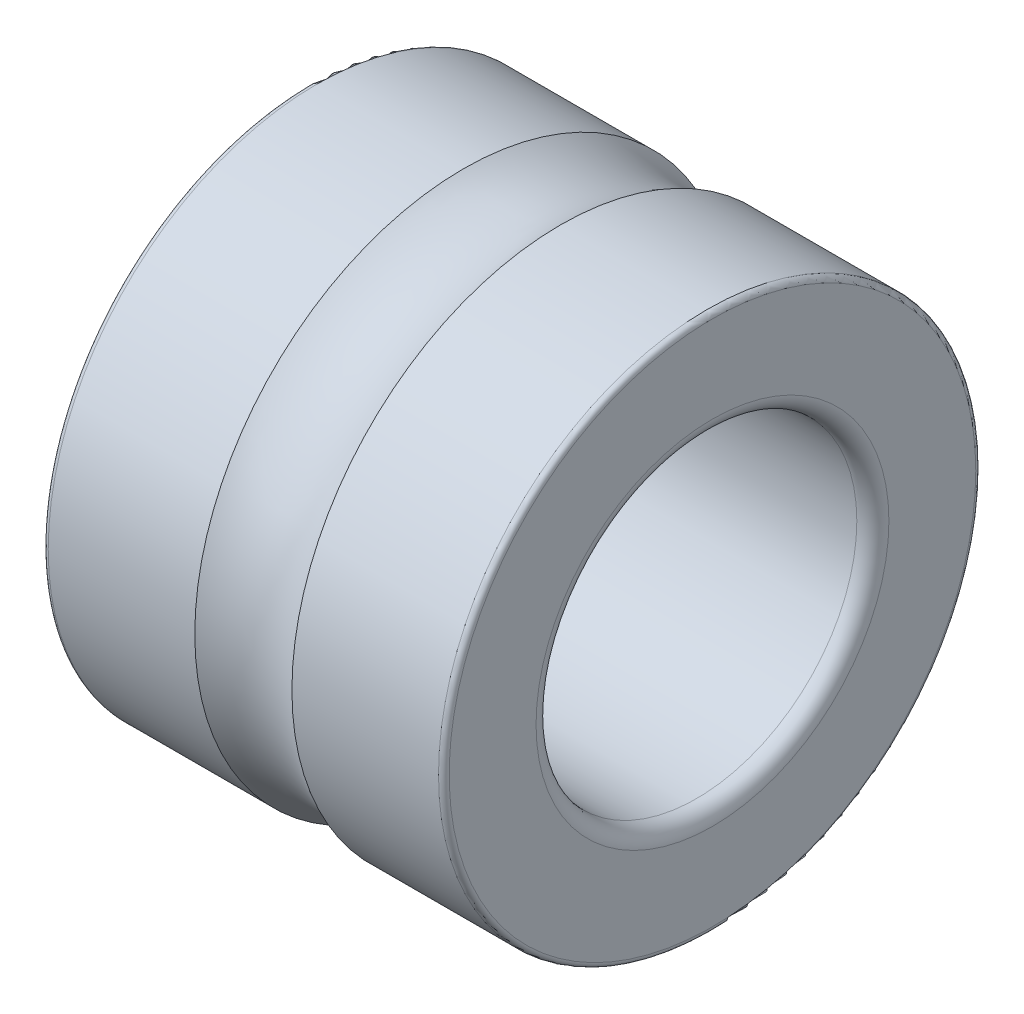
ISO-10303-21;
HEADER;
FILE_DESCRIPTION(('STEP AP214'),'2;1');
FILE_NAME('part.step','',(''),(''),'','','');
FILE_SCHEMA(('AUTOMOTIVE_DESIGN { 1 0 10303 214 1 1 1 1 }'));
ENDSEC;
DATA;
#1=APPLICATION_CONTEXT('core data for automotive mechanical design processes');
#2=APPLICATION_PROTOCOL_DEFINITION('international standard','automotive_design',2000,#1);
#3=PRODUCT_CONTEXT('',#1,'mechanical');
#4=PRODUCT('Part','Part','',(#3));
#5=PRODUCT_RELATED_PRODUCT_CATEGORY('part','',(#4));
#6=PRODUCT_DEFINITION_FORMATION('','',#4);
#7=PRODUCT_DEFINITION_CONTEXT('part definition',#1,'design');
#8=PRODUCT_DEFINITION('design','',#6,#7);
#9=PRODUCT_DEFINITION_SHAPE('','',#8);
#10=(LENGTH_UNIT() NAMED_UNIT(*) SI_UNIT(.MILLI.,.METRE.));
#11=(NAMED_UNIT(*) PLANE_ANGLE_UNIT() SI_UNIT($,.RADIAN.));
#12=(NAMED_UNIT(*) SI_UNIT($,.STERADIAN.) SOLID_ANGLE_UNIT());
#13=UNCERTAINTY_MEASURE_WITH_UNIT(LENGTH_MEASURE(1.E-05),#10,'distance_accuracy_value','');
#14=(GEOMETRIC_REPRESENTATION_CONTEXT(3) GLOBAL_UNCERTAINTY_ASSIGNED_CONTEXT((#13)) GLOBAL_UNIT_ASSIGNED_CONTEXT((#10,
#11,#12)) REPRESENTATION_CONTEXT('',''));
#15=CARTESIAN_POINT('',(0.,0.,0.));
#16=DIRECTION('',(0.,0.,1.));
#17=DIRECTION('',(1.,0.,0.));
#18=AXIS2_PLACEMENT_3D('',#15,#16,#17);
#19=CARTESIAN_POINT('',(2.5,0.,0.));
#20=DIRECTION('',(1.,0.,0.));
#21=DIRECTION('',(0.,0.,-1.));
#22=AXIS2_PLACEMENT_3D('',#19,#20,#21);
#23=TOROIDAL_SURFACE('',#22,4.375,1.1905);
#24=CARTESIAN_POINT('',(1.89447109895563,0.,0.));
#25=DIRECTION('',(-1.,0.,0.));
#26=DIRECTION('',(0.,0.,1.));
#27=AXIS2_PLACEMENT_3D('',#24,#25,#26);
#28=CIRCLE('',#27,3.35);
#29=CARTESIAN_POINT('',(1.89447109895563,0.,3.35));
#30=VERTEX_POINT('',#29);
#31=EDGE_CURVE('E143',#30,#30,#28,.T.);
#32=ORIENTED_EDGE('',*,*,#31,.F.);
#33=EDGE_LOOP('',(#32));
#34=FACE_BOUND('',#33,.T.);
#35=CARTESIAN_POINT('',(3.10552890104437,0.,0.));
#36=DIRECTION('',(-1.,0.,0.));
#37=DIRECTION('',(0.,0.,1.));
#38=AXIS2_PLACEMENT_3D('',#35,#36,#37);
#39=CIRCLE('',#38,3.35);
#40=CARTESIAN_POINT('',(3.10552890104437,0.,3.35));
#41=VERTEX_POINT('',#40);
#42=EDGE_CURVE('E151',#41,#41,#39,.F.);
#43=ORIENTED_EDGE('',*,*,#42,.F.);
#44=EDGE_LOOP('',(#43));
#45=FACE_BOUND('',#44,.T.);
#46=ADVANCED_FACE('F15',(#34,#45),#23,.F.);
#47=CARTESIAN_POINT('',(4.8,0.,0.));
#48=DIRECTION('',(-1.,0.,0.));
#49=DIRECTION('',(0.,0.,1.));
#50=AXIS2_PLACEMENT_3D('',#47,#48,#49);
#51=CYLINDRICAL_SURFACE('',#50,3.35);
#52=CARTESIAN_POINT('',(4.933333,0.,0.));
#53=DIRECTION('',(1.,0.,0.));
#54=DIRECTION('',(0.,0.,-1.));
#55=AXIS2_PLACEMENT_3D('',#52,#53,#54);
#56=CIRCLE('',#55,3.35);
#57=CARTESIAN_POINT('',(4.933333,0.,-3.35));
#58=VERTEX_POINT('',#57);
#59=EDGE_CURVE('E113',#58,#58,#56,.T.);
#60=ORIENTED_EDGE('',*,*,#59,.F.);
#61=EDGE_LOOP('',(#60));
#62=FACE_BOUND('',#61,.T.);
#63=ORIENTED_EDGE('',*,*,#42,.T.);
#64=EDGE_LOOP('',(#63));
#65=FACE_BOUND('',#64,.T.);
#66=ADVANCED_FACE('F158',(#62,#65),#51,.T.);
#67=CARTESIAN_POINT('',(4.8,0.,0.));
#68=DIRECTION('',(-1.,0.,0.));
#69=DIRECTION('',(0.,0.,1.));
#70=AXIS2_PLACEMENT_3D('',#67,#68,#69);
#71=CYLINDRICAL_SURFACE('',#70,3.35);
#72=ORIENTED_EDGE('',*,*,#31,.T.);
#73=EDGE_LOOP('',(#72));
#74=FACE_BOUND('',#73,.T.);
#75=CARTESIAN_POINT('',(0.0666669999999993,0.,0.));
#76=DIRECTION('',(1.,0.,0.));
#77=DIRECTION('',(0.,0.,-1.));
#78=AXIS2_PLACEMENT_3D('',#75,#76,#77);
#79=CIRCLE('',#78,3.35);
#80=CARTESIAN_POINT('',(0.0666669999999993,0.,-3.35));
#81=VERTEX_POINT('',#80);
#82=EDGE_CURVE('E110',#81,#81,#79,.F.);
#83=ORIENTED_EDGE('',*,*,#82,.F.);
#84=EDGE_LOOP('',(#83));
#85=FACE_BOUND('',#84,.T.);
#86=ADVANCED_FACE('F136',(#74,#85),#71,.T.);
#87=CARTESIAN_POINT('',(4.933333,0.,0.));
#88=DIRECTION('',(1.,0.,0.));
#89=DIRECTION('',(0.,0.,-1.));
#90=AXIS2_PLACEMENT_3D('',#87,#88,#89);
#91=TOROIDAL_SURFACE('',#90,3.283333,0.0666670000000003);
#92=CARTESIAN_POINT('',(5.,0.,0.));
#93=DIRECTION('',(-1.,0.,0.));
#94=DIRECTION('',(0.,0.,-1.));
#95=AXIS2_PLACEMENT_3D('',#92,#93,#94);
#96=CIRCLE('',#95,3.283333);
#97=CARTESIAN_POINT('',(5.,0.,-3.283333));
#98=VERTEX_POINT('',#97);
#99=EDGE_CURVE('E65',#98,#98,#96,.F.);
#100=ORIENTED_EDGE('',*,*,#99,.F.);
#101=EDGE_LOOP('',(#100));
#102=FACE_BOUND('',#101,.T.);
#103=ORIENTED_EDGE('',*,*,#59,.T.);
#104=EDGE_LOOP('',(#103));
#105=FACE_BOUND('',#104,.T.);
#106=ADVANCED_FACE('F132',(#102,#105),#91,.T.);
#107=CARTESIAN_POINT('',(0.0666669999999993,0.,0.));
#108=DIRECTION('',(1.,0.,0.));
#109=DIRECTION('',(0.,0.,-1.));
#110=AXIS2_PLACEMENT_3D('',#107,#108,#109);
#111=TOROIDAL_SURFACE('',#110,3.283333,0.0666669999999994);
#112=ORIENTED_EDGE('',*,*,#82,.T.);
#113=EDGE_LOOP('',(#112));
#114=FACE_BOUND('',#113,.T.);
#115=CARTESIAN_POINT('',(0.,0.,0.));
#116=DIRECTION('',(1.,0.,0.));
#117=DIRECTION('',(0.,0.,-1.));
#118=AXIS2_PLACEMENT_3D('',#115,#116,#117);
#119=CIRCLE('',#118,3.283333);
#120=CARTESIAN_POINT('',(0.,0.,-3.283333));
#121=VERTEX_POINT('',#120);
#122=EDGE_CURVE('E120',#121,#121,#119,.F.);
#123=ORIENTED_EDGE('',*,*,#122,.F.);
#124=EDGE_LOOP('',(#123));
#125=FACE_BOUND('',#124,.T.);
#126=ADVANCED_FACE('F82',(#114,#125),#111,.T.);
#127=CARTESIAN_POINT('',(5.,2.2,0.));
#128=DIRECTION('',(1.,0.,0.));
#129=DIRECTION('',(0.,0.,-1.));
#130=AXIS2_PLACEMENT_3D('',#127,#128,#129);
#131=PLANE('',#130);
#132=CARTESIAN_POINT('',(5.,0.,0.));
#133=DIRECTION('',(1.,0.,0.));
#134=DIRECTION('',(0.,0.,-1.));
#135=AXIS2_PLACEMENT_3D('',#132,#133,#134);
#136=CIRCLE('',#135,2.2);
#137=CARTESIAN_POINT('',(5.,0.,-2.2));
#138=VERTEX_POINT('',#137);
#139=EDGE_CURVE('E100',#138,#138,#136,.T.);
#140=ORIENTED_EDGE('',*,*,#139,.F.);
#141=EDGE_LOOP('',(#140));
#142=FACE_BOUND('',#141,.T.);
#143=ORIENTED_EDGE('',*,*,#99,.T.);
#144=EDGE_LOOP('',(#143));
#145=FACE_BOUND('',#144,.T.);
#146=ADVANCED_FACE('F72',(#142,#145),#131,.T.);
#147=CARTESIAN_POINT('',(0.,3.283333,0.));
#148=DIRECTION('',(-1.,0.,0.));
#149=DIRECTION('',(0.,0.,1.));
#150=AXIS2_PLACEMENT_3D('',#147,#148,#149);
#151=PLANE('',#150);
#152=ORIENTED_EDGE('',*,*,#122,.T.);
#153=EDGE_LOOP('',(#152));
#154=FACE_BOUND('',#153,.T.);
#155=CARTESIAN_POINT('',(0.,0.,0.));
#156=DIRECTION('',(-1.,0.,0.));
#157=DIRECTION('',(0.,0.,-1.));
#158=AXIS2_PLACEMENT_3D('',#155,#156,#157);
#159=CIRCLE('',#158,2.2);
#160=CARTESIAN_POINT('',(0.,0.,-2.2));
#161=VERTEX_POINT('',#160);
#162=EDGE_CURVE('E27',#161,#161,#159,.T.);
#163=ORIENTED_EDGE('',*,*,#162,.F.);
#164=EDGE_LOOP('',(#163));
#165=FACE_BOUND('',#164,.T.);
#166=ADVANCED_FACE('F81',(#154,#165),#151,.T.);
#167=CARTESIAN_POINT('',(4.8,0.,0.));
#168=DIRECTION('',(1.,0.,0.));
#169=DIRECTION('',(0.,0.,-1.));
#170=AXIS2_PLACEMENT_3D('',#167,#168,#169);
#171=TOROIDAL_SURFACE('',#170,2.2,0.199999999999999);
#172=CARTESIAN_POINT('',(4.8,0.,0.));
#173=DIRECTION('',(-1.,0.,0.));
#174=DIRECTION('',(0.,0.,1.));
#175=AXIS2_PLACEMENT_3D('',#172,#173,#174);
#176=CIRCLE('',#175,2.);
#177=CARTESIAN_POINT('',(4.8,0.,2.));
#178=VERTEX_POINT('',#177);
#179=EDGE_CURVE('E22',#178,#178,#176,.T.);
#180=ORIENTED_EDGE('',*,*,#179,.T.);
#181=EDGE_LOOP('',(#180));
#182=FACE_BOUND('',#181,.T.);
#183=ORIENTED_EDGE('',*,*,#139,.T.);
#184=EDGE_LOOP('',(#183));
#185=FACE_BOUND('',#184,.T.);
#186=ADVANCED_FACE('F45',(#182,#185),#171,.T.);
#187=CARTESIAN_POINT('',(0.2,0.,0.));
#188=DIRECTION('',(1.,0.,0.));
#189=DIRECTION('',(0.,0.,-1.));
#190=AXIS2_PLACEMENT_3D('',#187,#188,#189);
#191=TOROIDAL_SURFACE('',#190,2.2,0.2);
#192=ORIENTED_EDGE('',*,*,#162,.T.);
#193=EDGE_LOOP('',(#192));
#194=FACE_BOUND('',#193,.T.);
#195=CARTESIAN_POINT('',(0.2,0.,0.));
#196=DIRECTION('',(-1.,0.,0.));
#197=DIRECTION('',(0.,0.,1.));
#198=AXIS2_PLACEMENT_3D('',#195,#196,#197);
#199=CIRCLE('',#198,2.);
#200=CARTESIAN_POINT('',(0.2,0.,2.));
#201=VERTEX_POINT('',#200);
#202=EDGE_CURVE('E10',#201,#201,#199,.F.);
#203=ORIENTED_EDGE('',*,*,#202,.T.);
#204=EDGE_LOOP('',(#203));
#205=FACE_BOUND('',#204,.T.);
#206=ADVANCED_FACE('F39',(#194,#205),#191,.T.);
#207=CARTESIAN_POINT('',(4.8,0.,0.));
#208=DIRECTION('',(-1.,0.,0.));
#209=DIRECTION('',(0.,0.,1.));
#210=AXIS2_PLACEMENT_3D('',#207,#208,#209);
#211=CYLINDRICAL_SURFACE('',#210,2.);
#212=ORIENTED_EDGE('',*,*,#202,.F.);
#213=EDGE_LOOP('',(#212));
#214=FACE_BOUND('',#213,.T.);
#215=ORIENTED_EDGE('',*,*,#179,.F.);
#216=EDGE_LOOP('',(#215));
#217=FACE_BOUND('',#216,.T.);
#218=ADVANCED_FACE('F44',(#214,#217),#211,.F.);
#219=CLOSED_SHELL('',(#46,#66,#86,#106,#126,#146,#166,#186,#206,#218));
#220=MANIFOLD_SOLID_BREP('B1',#219);
#221=ADVANCED_BREP_SHAPE_REPRESENTATION('',(#18,#220),#14);
#222=SHAPE_DEFINITION_REPRESENTATION(#9,#221);
ENDSEC;
END-ISO-10303-21;
